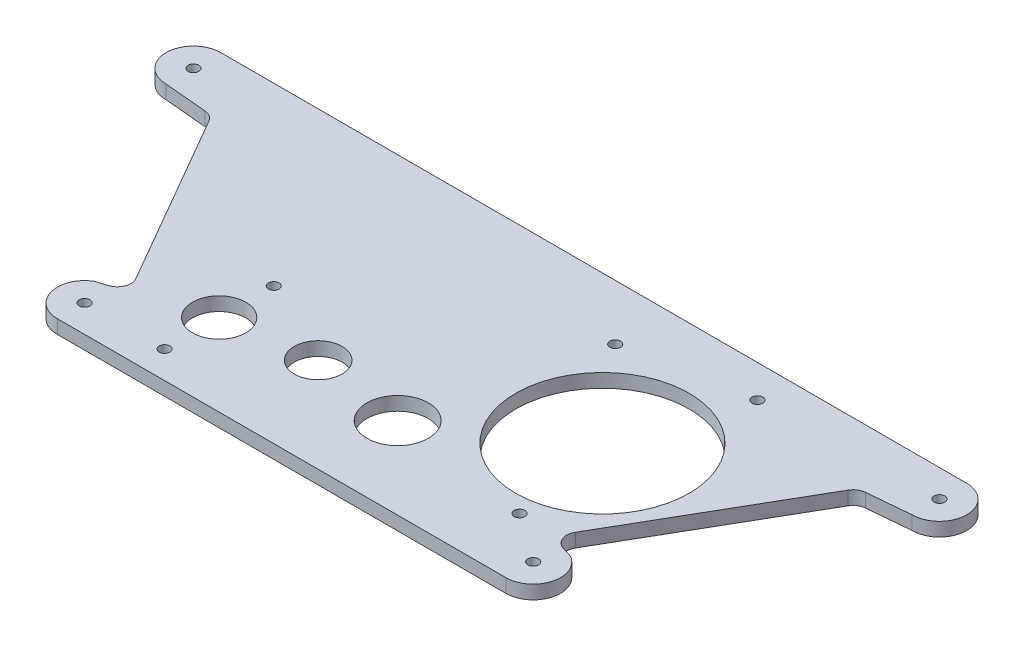
ISO-10303-21;
HEADER;
FILE_DESCRIPTION(('STEP AP214'),'2;1');
FILE_NAME('part.step','',(''),(''),'','','');
FILE_SCHEMA(('AUTOMOTIVE_DESIGN { 1 0 10303 214 1 1 1 1 }'));
ENDSEC;
DATA;
#1=APPLICATION_CONTEXT('core data for automotive mechanical design processes');
#2=APPLICATION_PROTOCOL_DEFINITION('international standard','automotive_design',2000,#1);
#3=PRODUCT_CONTEXT('',#1,'mechanical');
#4=PRODUCT('Part','Part','',(#3));
#5=PRODUCT_RELATED_PRODUCT_CATEGORY('part','',(#4));
#6=PRODUCT_DEFINITION_FORMATION('','',#4);
#7=PRODUCT_DEFINITION_CONTEXT('part definition',#1,'design');
#8=PRODUCT_DEFINITION('design','',#6,#7);
#9=PRODUCT_DEFINITION_SHAPE('','',#8);
#10=(LENGTH_UNIT() NAMED_UNIT(*) SI_UNIT(.MILLI.,.METRE.));
#11=(NAMED_UNIT(*) PLANE_ANGLE_UNIT() SI_UNIT($,.RADIAN.));
#12=(NAMED_UNIT(*) SI_UNIT($,.STERADIAN.) SOLID_ANGLE_UNIT());
#13=UNCERTAINTY_MEASURE_WITH_UNIT(LENGTH_MEASURE(1.E-05),#10,'distance_accuracy_value','');
#14=(GEOMETRIC_REPRESENTATION_CONTEXT(3) GLOBAL_UNCERTAINTY_ASSIGNED_CONTEXT((#13)) GLOBAL_UNIT_ASSIGNED_CONTEXT((#10,
#11,#12)) REPRESENTATION_CONTEXT('',''));
#15=CARTESIAN_POINT('',(0.,0.,0.));
#16=DIRECTION('',(0.,0.,1.));
#17=DIRECTION('',(1.,0.,0.));
#18=AXIS2_PLACEMENT_3D('',#15,#16,#17);
#19=CARTESIAN_POINT('',(173.47868782791,6.35,-59.890962088643));
#20=DIRECTION('',(0.,-1.,0.));
#21=DIRECTION('',(0.,0.,-1.));
#22=AXIS2_PLACEMENT_3D('',#19,#20,#21);
#23=CYLINDRICAL_SURFACE('',#22,12.7);
#24=CARTESIAN_POINT('',(173.47868782791,0.,-59.890962088643));
#25=DIRECTION('',(0.,1.,0.));
#26=DIRECTION('',(0.,0.,1.));
#27=AXIS2_PLACEMENT_3D('',#24,#25,#26);
#28=CIRCLE('',#27,12.7);
#29=CARTESIAN_POINT('',(173.47868782791,0.,-72.5909620886429));
#30=VERTEX_POINT('',#29);
#31=CARTESIAN_POINT('',(173.47868782791,0.,-47.190962088643));
#32=VERTEX_POINT('',#31);
#33=EDGE_CURVE('E155',#30,#32,#28,.F.);
#34=ORIENTED_EDGE('',*,*,#33,.F.);
#35=DIRECTION('',(0.,-1.,0.));
#36=VECTOR('',#35,1.);
#37=CARTESIAN_POINT('',(173.47868782791,6.35,-72.5909620886429));
#38=LINE('',#37,#36);
#39=CARTESIAN_POINT('',(173.47868782791,6.35,-72.5909620886429));
#40=VERTEX_POINT('',#39);
#41=EDGE_CURVE('E150',#40,#30,#38,.T.);
#42=ORIENTED_EDGE('',*,*,#41,.F.);
#43=CARTESIAN_POINT('',(173.47868782791,6.35,-59.890962088643));
#44=DIRECTION('',(0.,1.,0.));
#45=DIRECTION('',(0.,0.,1.));
#46=AXIS2_PLACEMENT_3D('',#43,#44,#45);
#47=CIRCLE('',#46,12.7);
#48=CARTESIAN_POINT('',(173.47868782791,6.35,-47.190962088643));
#49=VERTEX_POINT('',#48);
#50=EDGE_CURVE('E152',#40,#49,#47,.F.);
#51=ORIENTED_EDGE('',*,*,#50,.T.);
#52=DIRECTION('',(0.,-1.,0.));
#53=VECTOR('',#52,1.);
#54=CARTESIAN_POINT('',(173.47868782791,6.35,-47.190962088643));
#55=LINE('',#54,#53);
#56=EDGE_CURVE('E239',#49,#32,#55,.T.);
#57=ORIENTED_EDGE('',*,*,#56,.T.);
#58=EDGE_LOOP('',(#34,#42,#51,#57));
#59=FACE_BOUND('',#58,.T.);
#60=ADVANCED_FACE('F37',(#59),#23,.T.);
#61=CARTESIAN_POINT('',(0.,6.35,-72.5909620886429));
#62=DIRECTION('',(0.,0.,-1.));
#63=DIRECTION('',(-1.,0.,0.));
#64=AXIS2_PLACEMENT_3D('',#61,#62,#63);
#65=PLANE('',#64);
#66=DIRECTION('',(1.,0.,0.));
#67=VECTOR('',#66,1.);
#68=CARTESIAN_POINT('',(0.,0.,-72.5909620886429));
#69=LINE('',#68,#67);
#70=CARTESIAN_POINT('',(-173.47868782791,0.,-72.5909620886429));
#71=VERTEX_POINT('',#70);
#72=EDGE_CURVE('E241',#71,#30,#69,.T.);
#73=ORIENTED_EDGE('',*,*,#72,.F.);
#74=DIRECTION('',(0.,-1.,0.));
#75=VECTOR('',#74,1.);
#76=CARTESIAN_POINT('',(-173.47868782791,6.35,-72.5909620886429));
#77=LINE('',#76,#75);
#78=CARTESIAN_POINT('',(-173.47868782791,6.35,-72.5909620886429));
#79=VERTEX_POINT('',#78);
#80=EDGE_CURVE('E161',#79,#71,#77,.T.);
#81=ORIENTED_EDGE('',*,*,#80,.F.);
#82=DIRECTION('',(1.,0.,0.));
#83=VECTOR('',#82,1.);
#84=CARTESIAN_POINT('',(0.,6.35,-72.5909620886429));
#85=LINE('',#84,#83);
#86=EDGE_CURVE('E167',#79,#40,#85,.T.);
#87=ORIENTED_EDGE('',*,*,#86,.T.);
#88=ORIENTED_EDGE('',*,*,#41,.T.);
#89=EDGE_LOOP('',(#73,#81,#87,#88));
#90=FACE_BOUND('',#89,.T.);
#91=ADVANCED_FACE('F172',(#90),#65,.T.);
#92=CARTESIAN_POINT('',(-173.47868782791,6.35,-59.8909620886429));
#93=DIRECTION('',(0.,-1.,0.));
#94=DIRECTION('',(0.,0.,-1.));
#95=AXIS2_PLACEMENT_3D('',#92,#93,#94);
#96=CYLINDRICAL_SURFACE('',#95,12.7000000000001);
#97=CARTESIAN_POINT('',(-173.47868782791,0.,-59.8909620886429));
#98=DIRECTION('',(0.,1.,0.));
#99=DIRECTION('',(0.,0.,1.));
#100=AXIS2_PLACEMENT_3D('',#97,#98,#99);
#101=CIRCLE('',#100,12.7000000000001);
#102=CARTESIAN_POINT('',(-173.47868782791,0.,-47.1909620886429));
#103=VERTEX_POINT('',#102);
#104=EDGE_CURVE('E243',#71,#103,#101,.T.);
#105=ORIENTED_EDGE('',*,*,#104,.T.);
#106=DIRECTION('',(0.,-1.,0.));
#107=VECTOR('',#106,1.);
#108=CARTESIAN_POINT('',(-173.47868782791,6.35,-47.1909620886429));
#109=LINE('',#108,#107);
#110=CARTESIAN_POINT('',(-173.47868782791,6.35,-47.1909620886429));
#111=VERTEX_POINT('',#110);
#112=EDGE_CURVE('E318',#111,#103,#109,.T.);
#113=ORIENTED_EDGE('',*,*,#112,.F.);
#114=CARTESIAN_POINT('',(-173.47868782791,6.35,-59.8909620886429));
#115=DIRECTION('',(0.,1.,0.));
#116=DIRECTION('',(0.,0.,1.));
#117=AXIS2_PLACEMENT_3D('',#114,#115,#116);
#118=CIRCLE('',#117,12.7000000000001);
#119=EDGE_CURVE('E174',#79,#111,#118,.T.);
#120=ORIENTED_EDGE('',*,*,#119,.F.);
#121=ORIENTED_EDGE('',*,*,#80,.T.);
#122=EDGE_LOOP('',(#105,#113,#120,#121));
#123=FACE_BOUND('',#122,.T.);
#124=ADVANCED_FACE('F412',(#123),#96,.T.);
#125=CARTESIAN_POINT('',(2.82420584193501,6.35,-31.2656220769564));
#126=DIRECTION('',(0.0899631533604733,0.,-0.995945094388963));
#127=DIRECTION('',(-0.995945094388963,0.,-0.0899631533604733));
#128=AXIS2_PLACEMENT_3D('',#125,#126,#127);
#129=PLANE('',#128);
#130=DIRECTION('',(0.995945094388963,0.,0.0899631533604733));
#131=VECTOR('',#130,1.);
#132=CARTESIAN_POINT('',(2.82420584193501,0.,-31.2656220769564));
#133=LINE('',#132,#131);
#134=CARTESIAN_POINT('',(-153.552216998124,0.,-45.3910153232112));
#135=VERTEX_POINT('',#134);
#136=EDGE_CURVE('E245',#103,#135,#133,.T.);
#137=ORIENTED_EDGE('',*,*,#136,.T.);
#138=DIRECTION('',(0.,-1.,0.));
#139=VECTOR('',#138,1.);
#140=CARTESIAN_POINT('',(-153.552216998124,6.35,-45.3910153232112));
#141=LINE('',#140,#139);
#142=CARTESIAN_POINT('',(-153.552216998124,6.35,-45.3910153232112));
#143=VERTEX_POINT('',#142);
#144=EDGE_CURVE('E52',#135,#143,#141,.F.);
#145=ORIENTED_EDGE('',*,*,#144,.T.);
#146=DIRECTION('',(0.995945094388963,0.,0.0899631533604733));
#147=VECTOR('',#146,1.);
#148=CARTESIAN_POINT('',(2.82420584193501,6.35,-31.2656220769564));
#149=LINE('',#148,#147);
#150=EDGE_CURVE('E176',#111,#143,#149,.T.);
#151=ORIENTED_EDGE('',*,*,#150,.F.);
#152=ORIENTED_EDGE('',*,*,#112,.T.);
#153=EDGE_LOOP('',(#137,#145,#151,#152));
#154=FACE_BOUND('',#153,.T.);
#155=ADVANCED_FACE('F626',(#154),#129,.F.);
#156=CARTESIAN_POINT('',(-93.1769459299427,6.35,53.7957348149193));
#157=DIRECTION('',(0.86602540378444,0.,-0.499999999999998));
#158=DIRECTION('',(-0.499999999999998,0.,-0.86602540378444));
#159=AXIS2_PLACEMENT_3D('',#156,#157,#158);
#160=PLANE('',#159);
#161=DIRECTION('',(0.499999999999998,0.,0.86602540378444));
#162=VECTOR('',#161,1.);
#163=CARTESIAN_POINT('',(-93.1769459299427,0.,53.7957348149193));
#164=LINE('',#163,#162);
#165=CARTESIAN_POINT('',(-148.624221707932,0.,-42.2417639738412));
#166=VERTEX_POINT('',#165);
#167=CARTESIAN_POINT('',(-102.196639961433,0.,38.173166483653));
#168=VERTEX_POINT('',#167);
#169=EDGE_CURVE('E247',#166,#168,#164,.T.);
#170=ORIENTED_EDGE('',*,*,#169,.T.);
#171=DIRECTION('',(0.,-1.,0.));
#172=VECTOR('',#171,1.);
#173=CARTESIAN_POINT('',(-102.196639961433,6.35,38.173166483653));
#174=LINE('',#173,#172);
#175=CARTESIAN_POINT('',(-102.196639961433,6.35,38.173166483653));
#176=VERTEX_POINT('',#175);
#177=EDGE_CURVE('E327',#168,#176,#174,.F.);
#178=ORIENTED_EDGE('',*,*,#177,.T.);
#179=DIRECTION('',(0.499999999999998,0.,0.86602540378444));
#180=VECTOR('',#179,1.);
#181=CARTESIAN_POINT('',(-93.1769459299427,6.35,53.7957348149193));
#182=LINE('',#181,#180);
#183=CARTESIAN_POINT('',(-148.624221707932,6.35,-42.2417639738412));
#184=VERTEX_POINT('',#183);
#185=EDGE_CURVE('E180',#184,#176,#182,.T.);
#186=ORIENTED_EDGE('',*,*,#185,.F.);
#187=DIRECTION('',(0.,-1.,0.));
#188=VECTOR('',#187,1.);
#189=CARTESIAN_POINT('',(-148.624221707932,0.,-42.2417639738412));
#190=LINE('',#189,#188);
#191=EDGE_CURVE('E324',#184,#166,#190,.T.);
#192=ORIENTED_EDGE('',*,*,#191,.T.);
#193=EDGE_LOOP('',(#170,#178,#186,#192));
#194=FACE_BOUND('',#193,.T.);
#195=ADVANCED_FACE('F396',(#194),#160,.F.);
#196=CARTESIAN_POINT('',(4.2335466809364,6.35,13.9031041796048));
#197=DIRECTION('',(-0.291298086746622,0.,-0.956632335151681));
#198=DIRECTION('',(-0.956632335151681,0.,0.291298086746622));
#199=AXIS2_PLACEMENT_3D('',#196,#197,#198);
#200=PLANE('',#199);
#201=DIRECTION('',(0.956632335151681,0.,-0.291298086746622));
#202=VECTOR('',#201,1.);
#203=CARTESIAN_POINT('',(4.2335466809364,6.35,13.9031041796048));
#204=LINE('',#203,#202);
#205=CARTESIAN_POINT('',(-110.672561660103,6.35,48.8924394605804));
#206=VERTEX_POINT('',#205);
#207=CARTESIAN_POINT('',(-105.846158424623,6.35,47.4227818118661));
#208=VERTEX_POINT('',#207);
#209=EDGE_CURVE('E183',#206,#208,#204,.T.);
#210=ORIENTED_EDGE('',*,*,#209,.T.);
#211=DIRECTION('',(0.,-1.,0.));
#212=VECTOR('',#211,1.);
#213=CARTESIAN_POINT('',(-105.846158424623,6.35,47.4227818118661));
#214=LINE('',#213,#212);
#215=CARTESIAN_POINT('',(-105.846158424623,0.,47.4227818118661));
#216=VERTEX_POINT('',#215);
#217=EDGE_CURVE('E160',#208,#216,#214,.T.);
#218=ORIENTED_EDGE('',*,*,#217,.T.);
#219=DIRECTION('',(0.956632335151681,0.,-0.291298086746622));
#220=VECTOR('',#219,1.);
#221=CARTESIAN_POINT('',(4.2335466809364,0.,13.9031041796048));
#222=LINE('',#221,#220);
#223=CARTESIAN_POINT('',(-110.672561660103,0.,48.8924394605804));
#224=VERTEX_POINT('',#223);
#225=EDGE_CURVE('E250',#224,#216,#222,.T.);
#226=ORIENTED_EDGE('',*,*,#225,.F.);
#227=DIRECTION('',(0.,-1.,0.));
#228=VECTOR('',#227,1.);
#229=CARTESIAN_POINT('',(-110.672561660103,6.35,48.8924394605804));
#230=LINE('',#229,#228);
#231=EDGE_CURVE('E316',#206,#224,#230,.T.);
#232=ORIENTED_EDGE('',*,*,#231,.F.);
#233=EDGE_LOOP('',(#210,#218,#226,#232));
#234=FACE_BOUND('',#233,.T.);
#235=ADVANCED_FACE('F391',(#234),#200,.T.);
#236=CARTESIAN_POINT('',(-104.322561660103,6.35,59.8909620886429));
#237=DIRECTION('',(0.,-1.,0.));
#238=DIRECTION('',(0.,0.,-1.));
#239=AXIS2_PLACEMENT_3D('',#236,#237,#238);
#240=CYLINDRICAL_SURFACE('',#239,12.7000000000001);
#241=CARTESIAN_POINT('',(-104.322561660103,0.,59.8909620886429));
#242=DIRECTION('',(0.,1.,0.));
#243=DIRECTION('',(0.,0.,1.));
#244=AXIS2_PLACEMENT_3D('',#241,#242,#243);
#245=CIRCLE('',#244,12.7000000000001);
#246=CARTESIAN_POINT('',(-104.322561660103,0.,72.590962088643));
#247=VERTEX_POINT('',#246);
#248=EDGE_CURVE('E253',#224,#247,#245,.T.);
#249=ORIENTED_EDGE('',*,*,#248,.T.);
#250=DIRECTION('',(0.,-1.,0.));
#251=VECTOR('',#250,1.);
#252=CARTESIAN_POINT('',(-104.322561660103,6.35,72.590962088643));
#253=LINE('',#252,#251);
#254=CARTESIAN_POINT('',(-104.322561660103,6.35,72.590962088643));
#255=VERTEX_POINT('',#254);
#256=EDGE_CURVE('E313',#255,#247,#253,.T.);
#257=ORIENTED_EDGE('',*,*,#256,.F.);
#258=CARTESIAN_POINT('',(-104.322561660103,6.35,59.8909620886429));
#259=DIRECTION('',(0.,1.,0.));
#260=DIRECTION('',(0.,0.,1.));
#261=AXIS2_PLACEMENT_3D('',#258,#259,#260);
#262=CIRCLE('',#261,12.7000000000001);
#263=EDGE_CURVE('E186',#206,#255,#262,.T.);
#264=ORIENTED_EDGE('',*,*,#263,.F.);
#265=ORIENTED_EDGE('',*,*,#231,.T.);
#266=EDGE_LOOP('',(#249,#257,#264,#265));
#267=FACE_BOUND('',#266,.T.);
#268=ADVANCED_FACE('F388',(#267),#240,.T.);
#269=CARTESIAN_POINT('',(0.,6.35,72.5909620886429));
#270=DIRECTION('',(0.,0.,-1.));
#271=DIRECTION('',(-1.,0.,0.));
#272=AXIS2_PLACEMENT_3D('',#269,#270,#271);
#273=PLANE('',#272);
#274=DIRECTION('',(1.,0.,0.));
#275=VECTOR('',#274,1.);
#276=CARTESIAN_POINT('',(0.,0.,72.5909620886429));
#277=LINE('',#276,#275);
#278=CARTESIAN_POINT('',(104.322561660103,0.,72.5909620886429));
#279=VERTEX_POINT('',#278);
#280=EDGE_CURVE('E255',#247,#279,#277,.T.);
#281=ORIENTED_EDGE('',*,*,#280,.T.);
#282=DIRECTION('',(0.,-1.,0.));
#283=VECTOR('',#282,1.);
#284=CARTESIAN_POINT('',(104.322561660103,6.35,72.5909620886429));
#285=LINE('',#284,#283);
#286=CARTESIAN_POINT('',(104.322561660103,6.35,72.5909620886429));
#287=VERTEX_POINT('',#286);
#288=EDGE_CURVE('E311',#287,#279,#285,.T.);
#289=ORIENTED_EDGE('',*,*,#288,.F.);
#290=DIRECTION('',(1.,0.,0.));
#291=VECTOR('',#290,1.);
#292=CARTESIAN_POINT('',(0.,6.35,72.5909620886429));
#293=LINE('',#292,#291);
#294=EDGE_CURVE('E188',#255,#287,#293,.T.);
#295=ORIENTED_EDGE('',*,*,#294,.F.);
#296=ORIENTED_EDGE('',*,*,#256,.T.);
#297=EDGE_LOOP('',(#281,#289,#295,#296));
#298=FACE_BOUND('',#297,.T.);
#299=ADVANCED_FACE('F383',(#298),#273,.F.);
#300=CARTESIAN_POINT('',(104.322561660103,6.35,59.8909620886429));
#301=DIRECTION('',(0.,-1.,0.));
#302=DIRECTION('',(0.,0.,-1.));
#303=AXIS2_PLACEMENT_3D('',#300,#301,#302);
#304=CYLINDRICAL_SURFACE('',#303,12.7);
#305=CARTESIAN_POINT('',(104.322561660103,0.,59.8909620886429));
#306=DIRECTION('',(0.,1.,0.));
#307=DIRECTION('',(0.,0.,1.));
#308=AXIS2_PLACEMENT_3D('',#305,#306,#307);
#309=CIRCLE('',#308,12.7);
#310=CARTESIAN_POINT('',(110.672561660103,0.,48.8924394605805));
#311=VERTEX_POINT('',#310);
#312=EDGE_CURVE('E258',#311,#279,#309,.F.);
#313=ORIENTED_EDGE('',*,*,#312,.F.);
#314=DIRECTION('',(0.,-1.,0.));
#315=VECTOR('',#314,1.);
#316=CARTESIAN_POINT('',(110.672561660103,6.35,48.8924394605805));
#317=LINE('',#316,#315);
#318=CARTESIAN_POINT('',(110.672561660103,6.35,48.8924394605805));
#319=VERTEX_POINT('',#318);
#320=EDGE_CURVE('E309',#319,#311,#317,.T.);
#321=ORIENTED_EDGE('',*,*,#320,.F.);
#322=CARTESIAN_POINT('',(104.322561660103,6.35,59.8909620886429));
#323=DIRECTION('',(0.,1.,0.));
#324=DIRECTION('',(0.,0.,1.));
#325=AXIS2_PLACEMENT_3D('',#322,#323,#324);
#326=CIRCLE('',#325,12.7);
#327=EDGE_CURVE('E190',#319,#287,#326,.F.);
#328=ORIENTED_EDGE('',*,*,#327,.T.);
#329=ORIENTED_EDGE('',*,*,#288,.T.);
#330=EDGE_LOOP('',(#313,#321,#328,#329));
#331=FACE_BOUND('',#330,.T.);
#332=ADVANCED_FACE('F377',(#331),#304,.T.);
#333=CARTESIAN_POINT('',(-4.23354668093621,6.35,13.9031041796036));
#334=DIRECTION('',(-0.291298086746632,0.,0.956632335151678));
#335=DIRECTION('',(0.956632335151678,0.,0.291298086746632));
#336=AXIS2_PLACEMENT_3D('',#333,#334,#335);
#337=PLANE('',#336);
#338=DIRECTION('',(-0.956632335151678,0.,-0.291298086746632));
#339=VECTOR('',#338,1.);
#340=CARTESIAN_POINT('',(-4.23354668093621,0.,13.9031041796036));
#341=LINE('',#340,#339);
#342=CARTESIAN_POINT('',(105.846158424623,0.,47.4227818118662));
#343=VERTEX_POINT('',#342);
#344=EDGE_CURVE('E261',#311,#343,#341,.T.);
#345=ORIENTED_EDGE('',*,*,#344,.T.);
#346=DIRECTION('',(0.,-1.,0.));
#347=VECTOR('',#346,1.);
#348=CARTESIAN_POINT('',(105.846158424623,6.35,47.4227818118662));
#349=LINE('',#348,#347);
#350=CARTESIAN_POINT('',(105.846158424623,6.35,47.4227818118662));
#351=VERTEX_POINT('',#350);
#352=EDGE_CURVE('E334',#343,#351,#349,.F.);
#353=ORIENTED_EDGE('',*,*,#352,.T.);
#354=DIRECTION('',(-0.956632335151678,0.,-0.291298086746632));
#355=VECTOR('',#354,1.);
#356=CARTESIAN_POINT('',(-4.23354668093621,6.35,13.9031041796036));
#357=LINE('',#356,#355);
#358=EDGE_CURVE('E193',#319,#351,#357,.T.);
#359=ORIENTED_EDGE('',*,*,#358,.F.);
#360=ORIENTED_EDGE('',*,*,#320,.T.);
#361=EDGE_LOOP('',(#345,#353,#359,#360));
#362=FACE_BOUND('',#361,.T.);
#363=ADVANCED_FACE('F373',(#362),#337,.F.);
#364=CARTESIAN_POINT('',(93.1769459299424,6.35,53.79573481492));
#365=DIRECTION('',(-0.866025403784436,0.,-0.500000000000004));
#366=DIRECTION('',(-0.500000000000004,0.,0.866025403784437));
#367=AXIS2_PLACEMENT_3D('',#364,#365,#366);
#368=PLANE('',#367);
#369=DIRECTION('',(0.500000000000004,0.,-0.866025403784436));
#370=VECTOR('',#369,1.);
#371=CARTESIAN_POINT('',(93.1769459299424,6.35,53.79573481492));
#372=LINE('',#371,#370);
#373=CARTESIAN_POINT('',(102.196639961433,6.35,38.173166483653));
#374=VERTEX_POINT('',#373);
#375=CARTESIAN_POINT('',(148.624221707933,6.35,-42.2417639738414));
#376=VERTEX_POINT('',#375);
#377=EDGE_CURVE('E196',#374,#376,#372,.T.);
#378=ORIENTED_EDGE('',*,*,#377,.F.);
#379=DIRECTION('',(0.,-1.,0.));
#380=VECTOR('',#379,1.);
#381=CARTESIAN_POINT('',(102.196639961433,0.,38.173166483653));
#382=LINE('',#381,#380);
#383=CARTESIAN_POINT('',(102.196639961433,0.,38.173166483653));
#384=VERTEX_POINT('',#383);
#385=EDGE_CURVE('E331',#374,#384,#382,.T.);
#386=ORIENTED_EDGE('',*,*,#385,.T.);
#387=DIRECTION('',(0.500000000000004,0.,-0.866025403784436));
#388=VECTOR('',#387,1.);
#389=CARTESIAN_POINT('',(93.1769459299424,0.,53.79573481492));
#390=LINE('',#389,#388);
#391=CARTESIAN_POINT('',(148.624221707933,0.,-42.2417639738414));
#392=VERTEX_POINT('',#391);
#393=EDGE_CURVE('E264',#384,#392,#390,.T.);
#394=ORIENTED_EDGE('',*,*,#393,.T.);
#395=DIRECTION('',(0.,-1.,0.));
#396=VECTOR('',#395,1.);
#397=CARTESIAN_POINT('',(148.624221707933,6.35,-42.2417639738414));
#398=LINE('',#397,#396);
#399=EDGE_CURVE('E329',#392,#376,#398,.F.);
#400=ORIENTED_EDGE('',*,*,#399,.T.);
#401=EDGE_LOOP('',(#378,#386,#394,#400));
#402=FACE_BOUND('',#401,.T.);
#403=ADVANCED_FACE('F364',(#402),#368,.F.);
#404=CARTESIAN_POINT('',(-104.322561660103,6.35,59.8909620886429));
#405=DIRECTION('',(0.,-1.,0.));
#406=DIRECTION('',(0.,0.,-1.));
#407=AXIS2_PLACEMENT_3D('',#404,#405,#406);
#408=CYLINDRICAL_SURFACE('',#407,2.48919999999996);
#409=CARTESIAN_POINT('',(-104.322561660103,6.35,59.8909620886429));
#410=DIRECTION('',(0.,1.,0.));
#411=DIRECTION('',(0.,0.,1.));
#412=AXIS2_PLACEMENT_3D('',#409,#410,#411);
#413=CIRCLE('',#412,2.48919999999996);
#414=CARTESIAN_POINT('',(-104.322561660103,6.35,62.3801620886428));
#415=VERTEX_POINT('',#414);
#416=EDGE_CURVE('E233',#415,#415,#413,.T.);
#417=ORIENTED_EDGE('',*,*,#416,.T.);
#418=EDGE_LOOP('',(#417));
#419=FACE_BOUND('',#418,.T.);
#420=CARTESIAN_POINT('',(-104.322561660103,0.,59.8909620886429));
#421=DIRECTION('',(0.,1.,0.));
#422=DIRECTION('',(0.,0.,1.));
#423=AXIS2_PLACEMENT_3D('',#420,#421,#422);
#424=CIRCLE('',#423,2.48919999999996);
#425=CARTESIAN_POINT('',(-104.322561660103,0.,62.3801620886428));
#426=VERTEX_POINT('',#425);
#427=EDGE_CURVE('E303',#426,#426,#424,.T.);
#428=ORIENTED_EDGE('',*,*,#427,.F.);
#429=EDGE_LOOP('',(#428));
#430=FACE_BOUND('',#429,.T.);
#431=ADVANCED_FACE('F568',(#419,#430),#408,.F.);
#432=CARTESIAN_POINT('',(-67.1328904804147,6.35,34.4909620886429));
#433=DIRECTION('',(0.,-1.,0.));
#434=DIRECTION('',(0.,0.,-1.));
#435=AXIS2_PLACEMENT_3D('',#432,#433,#434);
#436=CYLINDRICAL_SURFACE('',#435,12.3825);
#437=CARTESIAN_POINT('',(-67.1328904804147,6.35,34.4909620886429));
#438=DIRECTION('',(0.,1.,0.));
#439=DIRECTION('',(0.,0.,1.));
#440=AXIS2_PLACEMENT_3D('',#437,#438,#439);
#441=CIRCLE('',#440,12.3825);
#442=CARTESIAN_POINT('',(-67.1328904804147,6.35,46.873462088643));
#443=VERTEX_POINT('',#442);
#444=EDGE_CURVE('E230',#443,#443,#441,.T.);
#445=ORIENTED_EDGE('',*,*,#444,.T.);
#446=EDGE_LOOP('',(#445));
#447=FACE_BOUND('',#446,.T.);
#448=CARTESIAN_POINT('',(-67.1328904804147,0.,34.4909620886429));
#449=DIRECTION('',(0.,1.,0.));
#450=DIRECTION('',(0.,0.,1.));
#451=AXIS2_PLACEMENT_3D('',#448,#449,#450);
#452=CIRCLE('',#451,12.3825);
#453=CARTESIAN_POINT('',(-67.1328904804147,0.,46.873462088643));
#454=VERTEX_POINT('',#453);
#455=EDGE_CURVE('E300',#454,#454,#452,.T.);
#456=ORIENTED_EDGE('',*,*,#455,.F.);
#457=EDGE_LOOP('',(#456));
#458=FACE_BOUND('',#457,.T.);
#459=ADVANCED_FACE('F560',(#447,#458),#436,.F.);
#460=CARTESIAN_POINT('',(-67.1328904804147,6.35,9.09096208864295));
#461=DIRECTION('',(0.,-1.,0.));
#462=DIRECTION('',(0.,0.,-1.));
#463=AXIS2_PLACEMENT_3D('',#460,#461,#462);
#464=CYLINDRICAL_SURFACE('',#463,2.4892);
#465=CARTESIAN_POINT('',(-67.1328904804147,6.35,9.09096208864295));
#466=DIRECTION('',(0.,1.,0.));
#467=DIRECTION('',(0.,0.,1.));
#468=AXIS2_PLACEMENT_3D('',#465,#466,#467);
#469=CIRCLE('',#468,2.4892);
#470=CARTESIAN_POINT('',(-67.1328904804147,6.35,11.580162088643));
#471=VERTEX_POINT('',#470);
#472=EDGE_CURVE('E227',#471,#471,#469,.T.);
#473=ORIENTED_EDGE('',*,*,#472,.T.);
#474=EDGE_LOOP('',(#473));
#475=FACE_BOUND('',#474,.T.);
#476=CARTESIAN_POINT('',(-67.1328904804147,0.,9.09096208864295));
#477=DIRECTION('',(0.,1.,0.));
#478=DIRECTION('',(0.,0.,1.));
#479=AXIS2_PLACEMENT_3D('',#476,#477,#478);
#480=CIRCLE('',#479,2.4892);
#481=CARTESIAN_POINT('',(-67.1328904804147,0.,11.580162088643));
#482=VERTEX_POINT('',#481);
#483=EDGE_CURVE('E297',#482,#482,#480,.T.);
#484=ORIENTED_EDGE('',*,*,#483,.F.);
#485=EDGE_LOOP('',(#484));
#486=FACE_BOUND('',#485,.T.);
#487=ADVANCED_FACE('F552',(#475,#486),#464,.F.);
#488=CARTESIAN_POINT('',(-67.1328904804147,6.35,59.8909620886429));
#489=DIRECTION('',(0.,-1.,0.));
#490=DIRECTION('',(0.,0.,-1.));
#491=AXIS2_PLACEMENT_3D('',#488,#489,#490);
#492=CYLINDRICAL_SURFACE('',#491,2.4892);
#493=CARTESIAN_POINT('',(-67.1328904804147,6.35,59.8909620886429));
#494=DIRECTION('',(0.,1.,0.));
#495=DIRECTION('',(0.,0.,1.));
#496=AXIS2_PLACEMENT_3D('',#493,#494,#495);
#497=CIRCLE('',#496,2.4892);
#498=CARTESIAN_POINT('',(-67.1328904804147,6.35,62.3801620886429));
#499=VERTEX_POINT('',#498);
#500=EDGE_CURVE('E224',#499,#499,#497,.T.);
#501=ORIENTED_EDGE('',*,*,#500,.T.);
#502=EDGE_LOOP('',(#501));
#503=FACE_BOUND('',#502,.T.);
#504=CARTESIAN_POINT('',(-67.1328904804147,0.,59.8909620886429));
#505=DIRECTION('',(0.,1.,0.));
#506=DIRECTION('',(0.,0.,1.));
#507=AXIS2_PLACEMENT_3D('',#504,#505,#506);
#508=CIRCLE('',#507,2.4892);
#509=CARTESIAN_POINT('',(-67.1328904804147,0.,62.3801620886429));
#510=VERTEX_POINT('',#509);
#511=EDGE_CURVE('E294',#510,#510,#508,.T.);
#512=ORIENTED_EDGE('',*,*,#511,.F.);
#513=EDGE_LOOP('',(#512));
#514=FACE_BOUND('',#513,.T.);
#515=ADVANCED_FACE('F544',(#503,#514),#492,.F.);
#516=CARTESIAN_POINT('',(15.8743095195853,6.35,34.4909620886429));
#517=DIRECTION('',(0.,-1.,0.));
#518=DIRECTION('',(0.,0.,-1.));
#519=AXIS2_PLACEMENT_3D('',#516,#517,#518);
#520=CYLINDRICAL_SURFACE('',#519,14.3002);
#521=CARTESIAN_POINT('',(15.8743095195853,6.35,34.4909620886429));
#522=DIRECTION('',(0.,1.,0.));
#523=DIRECTION('',(0.,0.,1.));
#524=AXIS2_PLACEMENT_3D('',#521,#522,#523);
#525=CIRCLE('',#524,14.3002);
#526=CARTESIAN_POINT('',(15.8743095195853,6.35,48.7911620886429));
#527=VERTEX_POINT('',#526);
#528=EDGE_CURVE('E221',#527,#527,#525,.T.);
#529=ORIENTED_EDGE('',*,*,#528,.T.);
#530=EDGE_LOOP('',(#529));
#531=FACE_BOUND('',#530,.T.);
#532=CARTESIAN_POINT('',(15.8743095195853,0.,34.4909620886429));
#533=DIRECTION('',(0.,1.,0.));
#534=DIRECTION('',(0.,0.,1.));
#535=AXIS2_PLACEMENT_3D('',#532,#533,#534);
#536=CIRCLE('',#535,14.3002);
#537=CARTESIAN_POINT('',(15.8743095195853,0.,48.7911620886429));
#538=VERTEX_POINT('',#537);
#539=EDGE_CURVE('E291',#538,#538,#536,.T.);
#540=ORIENTED_EDGE('',*,*,#539,.F.);
#541=EDGE_LOOP('',(#540));
#542=FACE_BOUND('',#541,.T.);
#543=ADVANCED_FACE('F536',(#531,#542),#520,.F.);
#544=CARTESIAN_POINT('',(72.6440271534696,6.35,-3.9852066365439));
#545=DIRECTION('',(0.,-1.,0.));
#546=DIRECTION('',(0.,0.,-1.));
#547=AXIS2_PLACEMENT_3D('',#544,#545,#546);
#548=CYLINDRICAL_SURFACE('',#547,40.3224999999999);
#549=CARTESIAN_POINT('',(72.6440271534696,6.35,-3.9852066365439));
#550=DIRECTION('',(0.,1.,0.));
#551=DIRECTION('',(0.,0.,1.));
#552=AXIS2_PLACEMENT_3D('',#549,#550,#551);
#553=CIRCLE('',#552,40.3224999999999);
#554=CARTESIAN_POINT('',(72.6440271534696,6.35,36.337293363456));
#555=VERTEX_POINT('',#554);
#556=EDGE_CURVE('E218',#555,#555,#553,.T.);
#557=ORIENTED_EDGE('',*,*,#556,.T.);
#558=EDGE_LOOP('',(#557));
#559=FACE_BOUND('',#558,.T.);
#560=CARTESIAN_POINT('',(72.6440271534696,0.,-3.9852066365439));
#561=DIRECTION('',(0.,1.,0.));
#562=DIRECTION('',(0.,0.,1.));
#563=AXIS2_PLACEMENT_3D('',#560,#561,#562);
#564=CIRCLE('',#563,40.3224999999999);
#565=CARTESIAN_POINT('',(72.6440271534696,0.,36.337293363456));
#566=VERTEX_POINT('',#565);
#567=EDGE_CURVE('E288',#566,#566,#564,.T.);
#568=ORIENTED_EDGE('',*,*,#567,.F.);
#569=EDGE_LOOP('',(#568));
#570=FACE_BOUND('',#569,.T.);
#571=ADVANCED_FACE('F528',(#559,#570),#548,.F.);
#572=CARTESIAN_POINT('',(35.7108812729926,6.35,-46.8482323924025));
#573=DIRECTION('',(0.,-1.,0.));
#574=DIRECTION('',(0.,0.,-1.));
#575=AXIS2_PLACEMENT_3D('',#572,#573,#574);
#576=CYLINDRICAL_SURFACE('',#575,2.48919999999999);
#577=CARTESIAN_POINT('',(35.7108812729926,6.35,-46.8482323924025));
#578=DIRECTION('',(0.,1.,0.));
#579=DIRECTION('',(0.,0.,1.));
#580=AXIS2_PLACEMENT_3D('',#577,#578,#579);
#581=CIRCLE('',#580,2.48919999999999);
#582=CARTESIAN_POINT('',(35.7108812729926,6.35,-44.3590323924025));
#583=VERTEX_POINT('',#582);
#584=EDGE_CURVE('E215',#583,#583,#581,.T.);
#585=ORIENTED_EDGE('',*,*,#584,.T.);
#586=EDGE_LOOP('',(#585));
#587=FACE_BOUND('',#586,.T.);
#588=CARTESIAN_POINT('',(35.7108812729926,0.,-46.8482323924025));
#589=DIRECTION('',(0.,1.,0.));
#590=DIRECTION('',(0.,0.,1.));
#591=AXIS2_PLACEMENT_3D('',#588,#589,#590);
#592=CIRCLE('',#591,2.48919999999999);
#593=CARTESIAN_POINT('',(35.7108812729926,0.,-44.3590323924025));
#594=VERTEX_POINT('',#593);
#595=EDGE_CURVE('E285',#594,#594,#592,.T.);
#596=ORIENTED_EDGE('',*,*,#595,.F.);
#597=EDGE_LOOP('',(#596));
#598=FACE_BOUND('',#597,.T.);
#599=ADVANCED_FACE('F520',(#587,#598),#576,.F.);
#600=CARTESIAN_POINT('',(81.6717913916076,6.35,43.5653973291327));
#601=DIRECTION('',(0.,-1.,0.));
#602=DIRECTION('',(0.,0.,-1.));
#603=AXIS2_PLACEMENT_3D('',#600,#601,#602);
#604=CYLINDRICAL_SURFACE('',#603,2.4892);
#605=CARTESIAN_POINT('',(81.6717913916076,6.35,43.5653973291327));
#606=DIRECTION('',(0.,1.,0.));
#607=DIRECTION('',(0.,0.,1.));
#608=AXIS2_PLACEMENT_3D('',#605,#606,#607);
#609=CIRCLE('',#608,2.4892);
#610=CARTESIAN_POINT('',(81.6717913916076,6.35,46.0545973291327));
#611=VERTEX_POINT('',#610);
#612=EDGE_CURVE('E212',#611,#611,#609,.T.);
#613=ORIENTED_EDGE('',*,*,#612,.T.);
#614=EDGE_LOOP('',(#613));
#615=FACE_BOUND('',#614,.T.);
#616=CARTESIAN_POINT('',(81.6717913916076,0.,43.5653973291327));
#617=DIRECTION('',(0.,1.,0.));
#618=DIRECTION('',(0.,0.,1.));
#619=AXIS2_PLACEMENT_3D('',#616,#617,#618);
#620=CIRCLE('',#619,2.4892);
#621=CARTESIAN_POINT('',(81.6717913916076,0.,46.0545973291327));
#622=VERTEX_POINT('',#621);
#623=EDGE_CURVE('E282',#622,#622,#620,.T.);
#624=ORIENTED_EDGE('',*,*,#623,.F.);
#625=EDGE_LOOP('',(#624));
#626=FACE_BOUND('',#625,.T.);
#627=ADVANCED_FACE('F512',(#615,#626),#604,.F.);
#628=CARTESIAN_POINT('',(-26.9117262209288,6.35,28.6713791472757));
#629=DIRECTION('',(0.,-1.,0.));
#630=DIRECTION('',(0.,0.,-1.));
#631=AXIS2_PLACEMENT_3D('',#628,#629,#630);
#632=CYLINDRICAL_SURFACE('',#631,11.1252);
#633=CARTESIAN_POINT('',(-26.9117262209288,6.35,28.6713791472757));
#634=DIRECTION('',(0.,1.,0.));
#635=DIRECTION('',(0.,0.,1.));
#636=AXIS2_PLACEMENT_3D('',#633,#634,#635);
#637=CIRCLE('',#636,11.1252);
#638=CARTESIAN_POINT('',(-26.9117262209288,6.35,39.7965791472757));
#639=VERTEX_POINT('',#638);
#640=EDGE_CURVE('E209',#639,#639,#637,.T.);
#641=ORIENTED_EDGE('',*,*,#640,.T.);
#642=EDGE_LOOP('',(#641));
#643=FACE_BOUND('',#642,.T.);
#644=CARTESIAN_POINT('',(-26.9117262209288,0.,28.6713791472757));
#645=DIRECTION('',(0.,1.,0.));
#646=DIRECTION('',(0.,0.,1.));
#647=AXIS2_PLACEMENT_3D('',#644,#645,#646);
#648=CIRCLE('',#647,11.1252);
#649=CARTESIAN_POINT('',(-26.9117262209288,0.,39.7965791472757));
#650=VERTEX_POINT('',#649);
#651=EDGE_CURVE('E279',#650,#650,#648,.T.);
#652=ORIENTED_EDGE('',*,*,#651,.F.);
#653=EDGE_LOOP('',(#652));
#654=FACE_BOUND('',#653,.T.);
#655=ADVANCED_FACE('F504',(#643,#654),#632,.F.);
#656=CARTESIAN_POINT('',(91.2979234008714,6.35,-57.4017620886429));
#657=DIRECTION('',(0.,-1.,0.));
#658=DIRECTION('',(0.,0.,-1.));
#659=AXIS2_PLACEMENT_3D('',#656,#657,#658);
#660=CYLINDRICAL_SURFACE('',#659,2.4892);
#661=CARTESIAN_POINT('',(91.2979234008714,6.35,-57.4017620886429));
#662=DIRECTION('',(0.,1.,0.));
#663=DIRECTION('',(0.,0.,1.));
#664=AXIS2_PLACEMENT_3D('',#661,#662,#663);
#665=CIRCLE('',#664,2.4892);
#666=CARTESIAN_POINT('',(91.2979234008714,6.35,-54.9125620886429));
#667=VERTEX_POINT('',#666);
#668=EDGE_CURVE('E206',#667,#667,#665,.T.);
#669=ORIENTED_EDGE('',*,*,#668,.T.);
#670=EDGE_LOOP('',(#669));
#671=FACE_BOUND('',#670,.T.);
#672=CARTESIAN_POINT('',(91.2979234008714,0.,-57.4017620886429));
#673=DIRECTION('',(0.,1.,0.));
#674=DIRECTION('',(0.,0.,1.));
#675=AXIS2_PLACEMENT_3D('',#672,#673,#674);
#676=CIRCLE('',#675,2.4892);
#677=CARTESIAN_POINT('',(91.2979234008714,0.,-54.9125620886429));
#678=VERTEX_POINT('',#677);
#679=EDGE_CURVE('E276',#678,#678,#676,.T.);
#680=ORIENTED_EDGE('',*,*,#679,.F.);
#681=EDGE_LOOP('',(#680));
#682=FACE_BOUND('',#681,.T.);
#683=ADVANCED_FACE('F496',(#671,#682),#660,.F.);
#684=CARTESIAN_POINT('',(-173.47868782791,6.35,-59.8909620886429));
#685=DIRECTION('',(0.,-1.,0.));
#686=DIRECTION('',(0.,0.,-1.));
#687=AXIS2_PLACEMENT_3D('',#684,#685,#686);
#688=CYLINDRICAL_SURFACE('',#687,2.48919999999998);
#689=CARTESIAN_POINT('',(-173.47868782791,6.35,-59.8909620886429));
#690=DIRECTION('',(0.,1.,0.));
#691=DIRECTION('',(0.,0.,1.));
#692=AXIS2_PLACEMENT_3D('',#689,#690,#691);
#693=CIRCLE('',#692,2.48919999999998);
#694=CARTESIAN_POINT('',(-173.47868782791,6.35,-57.4017620886429));
#695=VERTEX_POINT('',#694);
#696=EDGE_CURVE('E203',#695,#695,#693,.T.);
#697=ORIENTED_EDGE('',*,*,#696,.T.);
#698=EDGE_LOOP('',(#697));
#699=FACE_BOUND('',#698,.T.);
#700=CARTESIAN_POINT('',(-173.47868782791,0.,-59.8909620886429));
#701=DIRECTION('',(0.,1.,0.));
#702=DIRECTION('',(0.,0.,1.));
#703=AXIS2_PLACEMENT_3D('',#700,#701,#702);
#704=CIRCLE('',#703,2.48919999999998);
#705=CARTESIAN_POINT('',(-173.47868782791,0.,-57.4017620886429));
#706=VERTEX_POINT('',#705);
#707=EDGE_CURVE('E273',#706,#706,#704,.T.);
#708=ORIENTED_EDGE('',*,*,#707,.F.);
#709=EDGE_LOOP('',(#708));
#710=FACE_BOUND('',#709,.T.);
#711=ADVANCED_FACE('F489',(#699,#710),#688,.F.);
#712=CARTESIAN_POINT('',(173.47868782791,6.35,-59.890962088643));
#713=DIRECTION('',(0.,-1.,0.));
#714=DIRECTION('',(0.,0.,-1.));
#715=AXIS2_PLACEMENT_3D('',#712,#713,#714);
#716=CYLINDRICAL_SURFACE('',#715,2.4892);
#717=CARTESIAN_POINT('',(173.47868782791,6.35,-59.890962088643));
#718=DIRECTION('',(0.,1.,0.));
#719=DIRECTION('',(0.,0.,1.));
#720=AXIS2_PLACEMENT_3D('',#717,#718,#719);
#721=CIRCLE('',#720,2.4892);
#722=CARTESIAN_POINT('',(173.47868782791,6.35,-57.401762088643));
#723=VERTEX_POINT('',#722);
#724=EDGE_CURVE('E200',#723,#723,#721,.F.);
#725=ORIENTED_EDGE('',*,*,#724,.F.);
#726=EDGE_LOOP('',(#725));
#727=FACE_BOUND('',#726,.T.);
#728=CARTESIAN_POINT('',(173.47868782791,0.,-59.890962088643));
#729=DIRECTION('',(0.,1.,0.));
#730=DIRECTION('',(0.,0.,1.));
#731=AXIS2_PLACEMENT_3D('',#728,#729,#730);
#732=CIRCLE('',#731,2.4892);
#733=CARTESIAN_POINT('',(173.47868782791,0.,-57.401762088643));
#734=VERTEX_POINT('',#733);
#735=EDGE_CURVE('E270',#734,#734,#732,.F.);
#736=ORIENTED_EDGE('',*,*,#735,.T.);
#737=EDGE_LOOP('',(#736));
#738=FACE_BOUND('',#737,.T.);
#739=ADVANCED_FACE('F480',(#727,#738),#716,.F.);
#740=CARTESIAN_POINT('',(-2.82420584193502,6.35,-31.2656220769564));
#741=DIRECTION('',(0.0899631533604736,0.,0.995945094388963));
#742=DIRECTION('',(0.995945094388963,0.,-0.0899631533604736));
#743=AXIS2_PLACEMENT_3D('',#740,#741,#742);
#744=PLANE('',#743);
#745=DIRECTION('',(-0.995945094388963,0.,0.0899631533604736));
#746=VECTOR('',#745,1.);
#747=CARTESIAN_POINT('',(-2.82420584193502,6.35,-31.2656220769564));
#748=LINE('',#747,#746);
#749=CARTESIAN_POINT('',(153.552216998125,6.35,-45.3910153232113));
#750=VERTEX_POINT('',#749);
#751=EDGE_CURVE('E169',#49,#750,#748,.T.);
#752=ORIENTED_EDGE('',*,*,#751,.T.);
#753=DIRECTION('',(0.,-1.,0.));
#754=VECTOR('',#753,1.);
#755=CARTESIAN_POINT('',(153.552216998125,6.35,-45.3910153232113));
#756=LINE('',#755,#754);
#757=CARTESIAN_POINT('',(153.552216998125,0.,-45.3910153232113));
#758=VERTEX_POINT('',#757);
#759=EDGE_CURVE('E336',#750,#758,#756,.T.);
#760=ORIENTED_EDGE('',*,*,#759,.T.);
#761=DIRECTION('',(-0.995945094388963,0.,0.0899631533604736));
#762=VECTOR('',#761,1.);
#763=CARTESIAN_POINT('',(-2.82420584193502,0.,-31.2656220769564));
#764=LINE('',#763,#762);
#765=EDGE_CURVE('E267',#32,#758,#764,.T.);
#766=ORIENTED_EDGE('',*,*,#765,.F.);
#767=ORIENTED_EDGE('',*,*,#56,.F.);
#768=EDGE_LOOP('',(#752,#760,#766,#767));
#769=FACE_BOUND('',#768,.T.);
#770=ADVANCED_FACE('F357',(#769),#744,.T.);
#771=CARTESIAN_POINT('',(104.322561660103,6.35,59.8909620886429));
#772=DIRECTION('',(0.,-1.,0.));
#773=DIRECTION('',(0.,0.,-1.));
#774=AXIS2_PLACEMENT_3D('',#771,#772,#773);
#775=CYLINDRICAL_SURFACE('',#774,2.4892);
#776=CARTESIAN_POINT('',(104.322561660103,6.35,59.8909620886429));
#777=DIRECTION('',(0.,1.,0.));
#778=DIRECTION('',(0.,0.,1.));
#779=AXIS2_PLACEMENT_3D('',#776,#777,#778);
#780=CIRCLE('',#779,2.4892);
#781=CARTESIAN_POINT('',(104.322561660103,6.35,62.3801620886429));
#782=VERTEX_POINT('',#781);
#783=EDGE_CURVE('E236',#782,#782,#780,.F.);
#784=ORIENTED_EDGE('',*,*,#783,.F.);
#785=EDGE_LOOP('',(#784));
#786=FACE_BOUND('',#785,.T.);
#787=CARTESIAN_POINT('',(104.322561660103,0.,59.8909620886429));
#788=DIRECTION('',(0.,1.,0.));
#789=DIRECTION('',(0.,0.,1.));
#790=AXIS2_PLACEMENT_3D('',#787,#788,#789);
#791=CIRCLE('',#790,2.4892);
#792=CARTESIAN_POINT('',(104.322561660103,0.,62.3801620886429));
#793=VERTEX_POINT('',#792);
#794=EDGE_CURVE('E170',#793,#793,#791,.F.);
#795=ORIENTED_EDGE('',*,*,#794,.T.);
#796=EDGE_LOOP('',(#795));
#797=FACE_BOUND('',#796,.T.);
#798=ADVANCED_FACE('F460',(#786,#797),#775,.F.);
#799=CARTESIAN_POINT('',(0.,6.35,0.));
#800=DIRECTION('',(0.,1.,0.));
#801=DIRECTION('',(0.,0.,1.));
#802=AXIS2_PLACEMENT_3D('',#799,#800,#801);
#803=PLANE('',#802);
#804=ORIENTED_EDGE('',*,*,#50,.F.);
#805=ORIENTED_EDGE('',*,*,#86,.F.);
#806=ORIENTED_EDGE('',*,*,#119,.T.);
#807=ORIENTED_EDGE('',*,*,#150,.T.);
#808=CARTESIAN_POINT('',(-154.123483021963,6.35,-39.0667639738413));
#809=DIRECTION('',(0.,1.,0.));
#810=DIRECTION('',(0.,0.,1.));
#811=AXIS2_PLACEMENT_3D('',#808,#809,#810);
#812=CIRCLE('',#811,6.35);
#813=EDGE_CURVE('E11',#143,#184,#812,.F.);
#814=ORIENTED_EDGE('',*,*,#813,.T.);
#815=ORIENTED_EDGE('',*,*,#185,.T.);
#816=CARTESIAN_POINT('',(-107.695901275464,6.35,41.348166483653));
#817=DIRECTION('',(0.,1.,0.));
#818=DIRECTION('',(0.,0.,1.));
#819=AXIS2_PLACEMENT_3D('',#816,#817,#818);
#820=CIRCLE('',#819,6.35);
#821=EDGE_CURVE('E342',#176,#208,#820,.F.);
#822=ORIENTED_EDGE('',*,*,#821,.T.);
#823=ORIENTED_EDGE('',*,*,#209,.F.);
#824=ORIENTED_EDGE('',*,*,#263,.T.);
#825=ORIENTED_EDGE('',*,*,#294,.T.);
#826=ORIENTED_EDGE('',*,*,#327,.F.);
#827=ORIENTED_EDGE('',*,*,#358,.T.);
#828=CARTESIAN_POINT('',(107.695901275464,6.35,41.3481664836531));
#829=DIRECTION('',(0.,1.,0.));
#830=DIRECTION('',(0.,0.,1.));
#831=AXIS2_PLACEMENT_3D('',#828,#829,#830);
#832=CIRCLE('',#831,6.35);
#833=EDGE_CURVE('E346',#351,#374,#832,.F.);
#834=ORIENTED_EDGE('',*,*,#833,.T.);
#835=ORIENTED_EDGE('',*,*,#377,.T.);
#836=CARTESIAN_POINT('',(154.123483021964,6.35,-39.0667639738414));
#837=DIRECTION('',(0.,1.,0.));
#838=DIRECTION('',(0.,0.,1.));
#839=AXIS2_PLACEMENT_3D('',#836,#837,#838);
#840=CIRCLE('',#839,6.35);
#841=EDGE_CURVE('E350',#376,#750,#840,.F.);
#842=ORIENTED_EDGE('',*,*,#841,.T.);
#843=ORIENTED_EDGE('',*,*,#751,.F.);
#844=EDGE_LOOP('',(#804,#805,#806,#807,#814,#815,#822,#823,#824,#825,#826,#827,#834,#835,#842,#843));
#845=FACE_BOUND('',#844,.T.);
#846=ORIENTED_EDGE('',*,*,#724,.T.);
#847=EDGE_LOOP('',(#846));
#848=FACE_BOUND('',#847,.T.);
#849=ORIENTED_EDGE('',*,*,#696,.F.);
#850=EDGE_LOOP('',(#849));
#851=FACE_BOUND('',#850,.T.);
#852=ORIENTED_EDGE('',*,*,#668,.F.);
#853=EDGE_LOOP('',(#852));
#854=FACE_BOUND('',#853,.T.);
#855=ORIENTED_EDGE('',*,*,#640,.F.);
#856=EDGE_LOOP('',(#855));
#857=FACE_BOUND('',#856,.T.);
#858=ORIENTED_EDGE('',*,*,#612,.F.);
#859=EDGE_LOOP('',(#858));
#860=FACE_BOUND('',#859,.T.);
#861=ORIENTED_EDGE('',*,*,#584,.F.);
#862=EDGE_LOOP('',(#861));
#863=FACE_BOUND('',#862,.T.);
#864=ORIENTED_EDGE('',*,*,#556,.F.);
#865=EDGE_LOOP('',(#864));
#866=FACE_BOUND('',#865,.T.);
#867=ORIENTED_EDGE('',*,*,#528,.F.);
#868=EDGE_LOOP('',(#867));
#869=FACE_BOUND('',#868,.T.);
#870=ORIENTED_EDGE('',*,*,#500,.F.);
#871=EDGE_LOOP('',(#870));
#872=FACE_BOUND('',#871,.T.);
#873=ORIENTED_EDGE('',*,*,#472,.F.);
#874=EDGE_LOOP('',(#873));
#875=FACE_BOUND('',#874,.T.);
#876=ORIENTED_EDGE('',*,*,#444,.F.);
#877=EDGE_LOOP('',(#876));
#878=FACE_BOUND('',#877,.T.);
#879=ORIENTED_EDGE('',*,*,#416,.F.);
#880=EDGE_LOOP('',(#879));
#881=FACE_BOUND('',#880,.T.);
#882=ORIENTED_EDGE('',*,*,#783,.T.);
#883=EDGE_LOOP('',(#882));
#884=FACE_BOUND('',#883,.T.);
#885=ADVANCED_FACE('F165',(#845,#848,#851,#854,#857,#860,#863,#866,#869,#872,#875,#878,#881,
#884),#803,.T.);
#886=CARTESIAN_POINT('',(0.,0.,0.));
#887=DIRECTION('',(0.,1.,0.));
#888=DIRECTION('',(0.,0.,1.));
#889=AXIS2_PLACEMENT_3D('',#886,#887,#888);
#890=PLANE('',#889);
#891=ORIENTED_EDGE('',*,*,#33,.T.);
#892=ORIENTED_EDGE('',*,*,#765,.T.);
#893=CARTESIAN_POINT('',(154.123483021964,0.,-39.0667639738414));
#894=DIRECTION('',(0.,1.,0.));
#895=DIRECTION('',(0.,0.,1.));
#896=AXIS2_PLACEMENT_3D('',#893,#894,#895);
#897=CIRCLE('',#896,6.35);
#898=EDGE_CURVE('E348',#758,#392,#897,.T.);
#899=ORIENTED_EDGE('',*,*,#898,.T.);
#900=ORIENTED_EDGE('',*,*,#393,.F.);
#901=CARTESIAN_POINT('',(107.695901275464,0.,41.3481664836531));
#902=DIRECTION('',(0.,1.,0.));
#903=DIRECTION('',(0.,0.,1.));
#904=AXIS2_PLACEMENT_3D('',#901,#902,#903);
#905=CIRCLE('',#904,6.35);
#906=EDGE_CURVE('E344',#384,#343,#905,.T.);
#907=ORIENTED_EDGE('',*,*,#906,.T.);
#908=ORIENTED_EDGE('',*,*,#344,.F.);
#909=ORIENTED_EDGE('',*,*,#312,.T.);
#910=ORIENTED_EDGE('',*,*,#280,.F.);
#911=ORIENTED_EDGE('',*,*,#248,.F.);
#912=ORIENTED_EDGE('',*,*,#225,.T.);
#913=CARTESIAN_POINT('',(-107.695901275464,0.,41.348166483653));
#914=DIRECTION('',(0.,1.,0.));
#915=DIRECTION('',(0.,0.,1.));
#916=AXIS2_PLACEMENT_3D('',#913,#914,#915);
#917=CIRCLE('',#916,6.35);
#918=EDGE_CURVE('E340',#216,#168,#917,.T.);
#919=ORIENTED_EDGE('',*,*,#918,.T.);
#920=ORIENTED_EDGE('',*,*,#169,.F.);
#921=CARTESIAN_POINT('',(-154.123483021963,0.,-39.0667639738413));
#922=DIRECTION('',(0.,1.,0.));
#923=DIRECTION('',(0.,0.,1.));
#924=AXIS2_PLACEMENT_3D('',#921,#922,#923);
#925=CIRCLE('',#924,6.35);
#926=EDGE_CURVE('E45',#166,#135,#925,.T.);
#927=ORIENTED_EDGE('',*,*,#926,.T.);
#928=ORIENTED_EDGE('',*,*,#136,.F.);
#929=ORIENTED_EDGE('',*,*,#104,.F.);
#930=ORIENTED_EDGE('',*,*,#72,.T.);
#931=EDGE_LOOP('',(#891,#892,#899,#900,#907,#908,#909,#910,#911,#912,#919,#920,#927,#928,#929,#930));
#932=FACE_BOUND('',#931,.T.);
#933=ORIENTED_EDGE('',*,*,#735,.F.);
#934=EDGE_LOOP('',(#933));
#935=FACE_BOUND('',#934,.T.);
#936=ORIENTED_EDGE('',*,*,#707,.T.);
#937=EDGE_LOOP('',(#936));
#938=FACE_BOUND('',#937,.T.);
#939=ORIENTED_EDGE('',*,*,#679,.T.);
#940=EDGE_LOOP('',(#939));
#941=FACE_BOUND('',#940,.T.);
#942=ORIENTED_EDGE('',*,*,#651,.T.);
#943=EDGE_LOOP('',(#942));
#944=FACE_BOUND('',#943,.T.);
#945=ORIENTED_EDGE('',*,*,#623,.T.);
#946=EDGE_LOOP('',(#945));
#947=FACE_BOUND('',#946,.T.);
#948=ORIENTED_EDGE('',*,*,#595,.T.);
#949=EDGE_LOOP('',(#948));
#950=FACE_BOUND('',#949,.T.);
#951=ORIENTED_EDGE('',*,*,#567,.T.);
#952=EDGE_LOOP('',(#951));
#953=FACE_BOUND('',#952,.T.);
#954=ORIENTED_EDGE('',*,*,#539,.T.);
#955=EDGE_LOOP('',(#954));
#956=FACE_BOUND('',#955,.T.);
#957=ORIENTED_EDGE('',*,*,#511,.T.);
#958=EDGE_LOOP('',(#957));
#959=FACE_BOUND('',#958,.T.);
#960=ORIENTED_EDGE('',*,*,#483,.T.);
#961=EDGE_LOOP('',(#960));
#962=FACE_BOUND('',#961,.T.);
#963=ORIENTED_EDGE('',*,*,#455,.T.);
#964=EDGE_LOOP('',(#963));
#965=FACE_BOUND('',#964,.T.);
#966=ORIENTED_EDGE('',*,*,#427,.T.);
#967=EDGE_LOOP('',(#966));
#968=FACE_BOUND('',#967,.T.);
#969=ORIENTED_EDGE('',*,*,#794,.F.);
#970=EDGE_LOOP('',(#969));
#971=FACE_BOUND('',#970,.T.);
#972=ADVANCED_FACE('F361',(#932,#935,#938,#941,#944,#947,#950,#953,#956,#959,#962,#965,#968,
#971),#890,.F.);
#973=CARTESIAN_POINT('',(-107.695901275464,6.35,41.348166483653));
#974=DIRECTION('',(0.,-1.,0.));
#975=DIRECTION('',(0.,0.,-1.));
#976=AXIS2_PLACEMENT_3D('',#973,#974,#975);
#977=CYLINDRICAL_SURFACE('',#976,6.35);
#978=ORIENTED_EDGE('',*,*,#821,.F.);
#979=ORIENTED_EDGE('',*,*,#177,.F.);
#980=ORIENTED_EDGE('',*,*,#918,.F.);
#981=ORIENTED_EDGE('',*,*,#217,.F.);
#982=EDGE_LOOP('',(#978,#979,#980,#981));
#983=FACE_BOUND('',#982,.T.);
#984=ADVANCED_FACE('F400',(#983),#977,.F.);
#985=CARTESIAN_POINT('',(107.695901275464,6.35,41.3481664836531));
#986=DIRECTION('',(0.,1.,0.));
#987=DIRECTION('',(0.,0.,1.));
#988=AXIS2_PLACEMENT_3D('',#985,#986,#987);
#989=CYLINDRICAL_SURFACE('',#988,6.35);
#990=ORIENTED_EDGE('',*,*,#833,.F.);
#991=ORIENTED_EDGE('',*,*,#352,.F.);
#992=ORIENTED_EDGE('',*,*,#906,.F.);
#993=ORIENTED_EDGE('',*,*,#385,.F.);
#994=EDGE_LOOP('',(#990,#991,#992,#993));
#995=FACE_BOUND('',#994,.T.);
#996=ADVANCED_FACE('F368',(#995),#989,.F.);
#997=CARTESIAN_POINT('',(154.123483021964,6.35,-39.0667639738414));
#998=DIRECTION('',(0.,-1.,0.));
#999=DIRECTION('',(0.,0.,-1.));
#1000=AXIS2_PLACEMENT_3D('',#997,#998,#999);
#1001=CYLINDRICAL_SURFACE('',#1000,6.35);
#1002=ORIENTED_EDGE('',*,*,#841,.F.);
#1003=ORIENTED_EDGE('',*,*,#399,.F.);
#1004=ORIENTED_EDGE('',*,*,#898,.F.);
#1005=ORIENTED_EDGE('',*,*,#759,.F.);
#1006=EDGE_LOOP('',(#1002,#1003,#1004,#1005));
#1007=FACE_BOUND('',#1006,.T.);
#1008=ADVANCED_FACE('F359',(#1007),#1001,.F.);
#1009=CARTESIAN_POINT('',(-154.123483021963,6.35,-39.0667639738413));
#1010=DIRECTION('',(0.,1.,0.));
#1011=DIRECTION('',(0.,0.,1.));
#1012=AXIS2_PLACEMENT_3D('',#1009,#1010,#1011);
#1013=CYLINDRICAL_SURFACE('',#1012,6.35);
#1014=ORIENTED_EDGE('',*,*,#813,.F.);
#1015=ORIENTED_EDGE('',*,*,#144,.F.);
#1016=ORIENTED_EDGE('',*,*,#926,.F.);
#1017=ORIENTED_EDGE('',*,*,#191,.F.);
#1018=EDGE_LOOP('',(#1014,#1015,#1016,#1017));
#1019=FACE_BOUND('',#1018,.T.);
#1020=ADVANCED_FACE('F39',(#1019),#1013,.F.);
#1021=CLOSED_SHELL('',(#60,#91,#124,#155,#195,#235,#268,#299,#332,#363,#403,#431,#459,#487,#515,
#543,#571,#599,#627,#655,#683,#711,#739,#770,#798,#885,#972,#984,#996,#1008,#1020));
#1022=MANIFOLD_SOLID_BREP('B2',#1021);
#1023=ADVANCED_BREP_SHAPE_REPRESENTATION('',(#18,#1022),#14);
#1024=SHAPE_DEFINITION_REPRESENTATION(#9,#1023);
ENDSEC;
END-ISO-10303-21;
